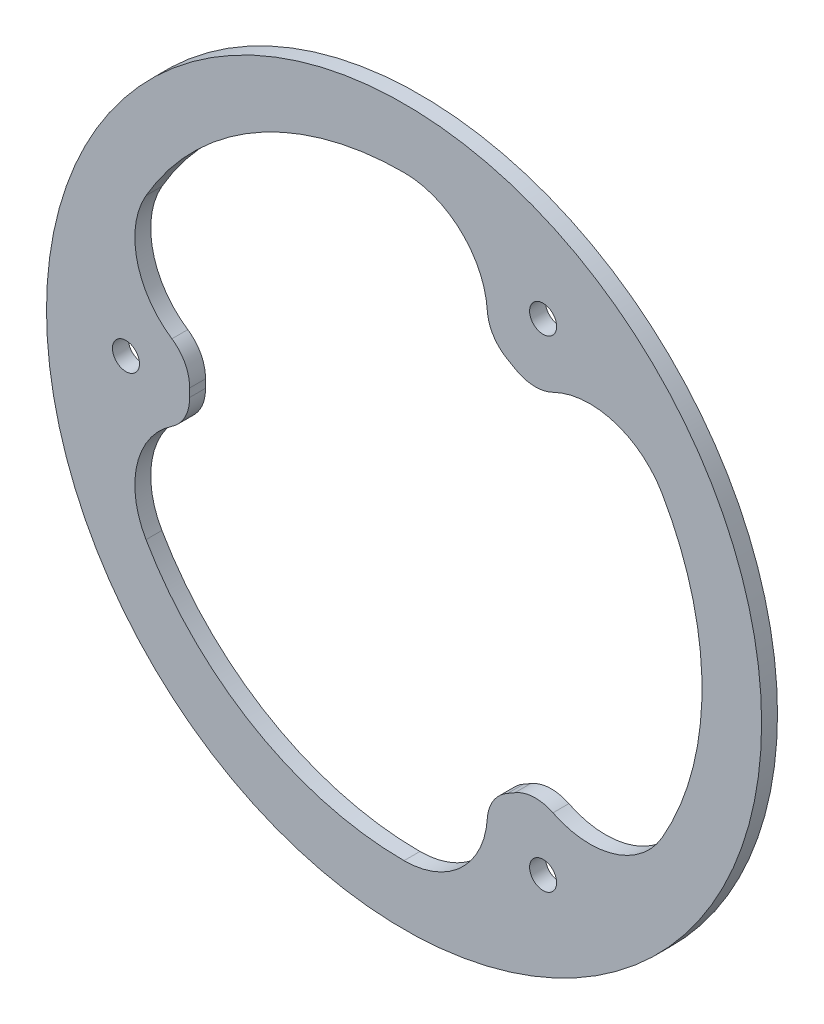
ISO-10303-21;
HEADER;
FILE_DESCRIPTION(('STEP AP214'),'2;1');
FILE_NAME('part.step','',(''),(''),'','','');
FILE_SCHEMA(('AUTOMOTIVE_DESIGN { 1 0 10303 214 1 1 1 1 }'));
ENDSEC;
DATA;
#1=APPLICATION_CONTEXT('core data for automotive mechanical design processes');
#2=APPLICATION_PROTOCOL_DEFINITION('international standard','automotive_design',2000,#1);
#3=PRODUCT_CONTEXT('',#1,'mechanical');
#4=PRODUCT('Part','Part','',(#3));
#5=PRODUCT_RELATED_PRODUCT_CATEGORY('part','',(#4));
#6=PRODUCT_DEFINITION_FORMATION('','',#4);
#7=PRODUCT_DEFINITION_CONTEXT('part definition',#1,'design');
#8=PRODUCT_DEFINITION('design','',#6,#7);
#9=PRODUCT_DEFINITION_SHAPE('','',#8);
#10=(LENGTH_UNIT() NAMED_UNIT(*) SI_UNIT(.MILLI.,.METRE.));
#11=(NAMED_UNIT(*) PLANE_ANGLE_UNIT() SI_UNIT($,.RADIAN.));
#12=(NAMED_UNIT(*) SI_UNIT($,.STERADIAN.) SOLID_ANGLE_UNIT());
#13=UNCERTAINTY_MEASURE_WITH_UNIT(LENGTH_MEASURE(1.E-05),#10,'distance_accuracy_value','');
#14=(GEOMETRIC_REPRESENTATION_CONTEXT(3) GLOBAL_UNCERTAINTY_ASSIGNED_CONTEXT((#13)) GLOBAL_UNIT_ASSIGNED_CONTEXT((#10,
#11,#12)) REPRESENTATION_CONTEXT('',''));
#15=CARTESIAN_POINT('',(0.,0.,0.));
#16=DIRECTION('',(0.,0.,1.));
#17=DIRECTION('',(1.,0.,0.));
#18=AXIS2_PLACEMENT_3D('',#15,#16,#17);
#19=CARTESIAN_POINT('',(0.,0.,14.));
#20=DIRECTION('',(0.,0.,1.));
#21=DIRECTION('',(1.,0.,0.));
#22=AXIS2_PLACEMENT_3D('',#19,#20,#21);
#23=PLANE('',#22);
#24=CARTESIAN_POINT('',(0.,0.,14.));
#25=DIRECTION('',(0.,0.,-1.));
#26=DIRECTION('',(-1.,0.,0.));
#27=AXIS2_PLACEMENT_3D('',#24,#25,#26);
#28=CIRCLE('',#27,27.);
#29=CARTESIAN_POINT('',(-26.9950568827488,-0.516627425867208,14.));
#30=VERTEX_POINT('',#29);
#31=CARTESIAN_POINT('',(-26.9950568827488,0.516627425867155,14.));
#32=VERTEX_POINT('',#31);
#33=EDGE_CURVE('E289',#30,#32,#28,.T.);
#34=ORIENTED_EDGE('',*,*,#33,.T.);
#35=CARTESIAN_POINT('',(-31.9941414906652,0.612299171398109,14.));
#36=DIRECTION('',(0.,0.,1.));
#37=DIRECTION('',(1.,0.,0.));
#38=AXIS2_PLACEMENT_3D('',#35,#36,#37);
#39=CIRCLE('',#38,5.);
#40=CARTESIAN_POINT('',(-29.2162525911538,4.76962201933419,14.));
#41=VERTEX_POINT('',#40);
#42=EDGE_CURVE('E263',#32,#41,#39,.T.);
#43=ORIENTED_EDGE('',*,*,#42,.T.);
#44=CARTESIAN_POINT('',(-23.3826859021799,13.4999999999999,14.));
#45=DIRECTION('',(0.,0.,-1.));
#46=DIRECTION('',(-1.,0.,0.));
#47=AXIS2_PLACEMENT_3D('',#44,#45,#46);
#48=CIRCLE('',#47,10.5);
#49=CARTESIAN_POINT('',(-32.4759526419165,18.7499999999999,14.));
#50=VERTEX_POINT('',#49);
#51=EDGE_CURVE('E210',#41,#50,#48,.T.);
#52=ORIENTED_EDGE('',*,*,#51,.T.);
#53=CARTESIAN_POINT('',(0.,0.,14.));
#54=DIRECTION('',(0.,0.,-1.));
#55=DIRECTION('',(-1.,0.,0.));
#56=AXIS2_PLACEMENT_3D('',#53,#54,#55);
#57=CIRCLE('',#56,37.5);
#58=CARTESIAN_POINT('',(0.,37.5,14.));
#59=VERTEX_POINT('',#58);
#60=EDGE_CURVE('E214',#50,#59,#57,.T.);
#61=ORIENTED_EDGE('',*,*,#60,.T.);
#62=CARTESIAN_POINT('',(0.,27.,14.));
#63=DIRECTION('',(0.,0.,-1.));
#64=DIRECTION('',(-1.,0.,0.));
#65=AXIS2_PLACEMENT_3D('',#62,#63,#64);
#66=CIRCLE('',#65,10.5);
#67=CARTESIAN_POINT('',(10.4775124603838,27.6868279569892,14.));
#68=VERTEX_POINT('',#67);
#69=EDGE_CURVE('E217',#59,#68,#66,.T.);
#70=ORIENTED_EDGE('',*,*,#69,.T.);
#71=CARTESIAN_POINT('',(15.4668041081856,28.0138888888889,14.));
#72=DIRECTION('',(0.,0.,1.));
#73=DIRECTION('',(1.,0.,0.));
#74=AXIS2_PLACEMENT_3D('',#71,#72,#73);
#75=CIRCLE('',#74,5.);
#76=CARTESIAN_POINT('',(13.0501159662816,23.63671875,14.));
#77=VERTEX_POINT('',#76);
#78=EDGE_CURVE('E52',#68,#77,#75,.T.);
#79=ORIENTED_EDGE('',*,*,#78,.T.);
#80=CARTESIAN_POINT('',(13.9449409164671,23.1200913241328,14.));
#81=VERTEX_POINT('',#80);
#82=EDGE_CURVE('E237',#77,#81,#28,.T.);
#83=ORIENTED_EDGE('',*,*,#82,.T.);
#84=CARTESIAN_POINT('',(16.5273373824795,27.4015897174907,14.));
#85=DIRECTION('',(0.,0.,1.));
#86=DIRECTION('',(1.,0.,0.));
#87=AXIS2_PLACEMENT_3D('',#84,#85,#86);
#88=CIRCLE('',#87,5.);
#89=CARTESIAN_POINT('',(18.7387401307699,22.917205937655,14.));
#90=VERTEX_POINT('',#89);
#91=EDGE_CURVE('E255',#81,#90,#88,.T.);
#92=ORIENTED_EDGE('',*,*,#91,.T.);
#93=CARTESIAN_POINT('',(23.3826859021798,13.5,14.));
#94=DIRECTION('',(0.,0.,-1.));
#95=DIRECTION('',(-1.,0.,0.));
#96=AXIS2_PLACEMENT_3D('',#93,#94,#95);
#97=CIRCLE('',#96,10.5);
#98=CARTESIAN_POINT('',(32.4759526419164,18.7500000000001,14.));
#99=VERTEX_POINT('',#98);
#100=EDGE_CURVE('E328',#90,#99,#97,.T.);
#101=ORIENTED_EDGE('',*,*,#100,.T.);
#102=CARTESIAN_POINT('',(0.,0.,14.));
#103=DIRECTION('',(0.,0.,-1.));
#104=DIRECTION('',(-1.,0.,0.));
#105=AXIS2_PLACEMENT_3D('',#102,#103,#104);
#106=CIRCLE('',#105,37.5);
#107=CARTESIAN_POINT('',(32.4759526419165,-18.75,14.));
#108=VERTEX_POINT('',#107);
#109=EDGE_CURVE('E329',#99,#108,#106,.T.);
#110=ORIENTED_EDGE('',*,*,#109,.T.);
#111=CARTESIAN_POINT('',(23.3826859021798,-13.5,14.));
#112=DIRECTION('',(0.,0.,-1.));
#113=DIRECTION('',(-1.,0.,0.));
#114=AXIS2_PLACEMENT_3D('',#111,#112,#113);
#115=CIRCLE('',#114,10.5);
#116=CARTESIAN_POINT('',(18.73874013077,-22.917205937655,14.));
#117=VERTEX_POINT('',#116);
#118=EDGE_CURVE('E191',#108,#117,#115,.T.);
#119=ORIENTED_EDGE('',*,*,#118,.T.);
#120=CARTESIAN_POINT('',(16.5273373824796,-27.4015897174907,14.));
#121=DIRECTION('',(0.,0.,1.));
#122=DIRECTION('',(1.,0.,0.));
#123=AXIS2_PLACEMENT_3D('',#120,#121,#122);
#124=CIRCLE('',#123,5.);
#125=CARTESIAN_POINT('',(13.9449409164672,-23.1200913241328,14.));
#126=VERTEX_POINT('',#125);
#127=EDGE_CURVE('E260',#117,#126,#124,.T.);
#128=ORIENTED_EDGE('',*,*,#127,.T.);
#129=CARTESIAN_POINT('',(13.0501159662817,-23.63671875,14.));
#130=VERTEX_POINT('',#129);
#131=EDGE_CURVE('E332',#126,#130,#28,.T.);
#132=ORIENTED_EDGE('',*,*,#131,.T.);
#133=CARTESIAN_POINT('',(15.4668041081857,-28.0138888888889,14.));
#134=DIRECTION('',(0.,0.,1.));
#135=DIRECTION('',(1.,0.,0.));
#136=AXIS2_PLACEMENT_3D('',#133,#134,#135);
#137=CIRCLE('',#136,5.);
#138=CARTESIAN_POINT('',(10.4775124603839,-27.6868279569892,14.));
#139=VERTEX_POINT('',#138);
#140=EDGE_CURVE('E258',#130,#139,#137,.T.);
#141=ORIENTED_EDGE('',*,*,#140,.T.);
#142=CARTESIAN_POINT('',(0.,-27.,14.));
#143=DIRECTION('',(0.,0.,-1.));
#144=DIRECTION('',(-1.,0.,0.));
#145=AXIS2_PLACEMENT_3D('',#142,#143,#144);
#146=CIRCLE('',#145,10.5);
#147=CARTESIAN_POINT('',(0.,-37.5,14.));
#148=VERTEX_POINT('',#147);
#149=EDGE_CURVE('E193',#139,#148,#146,.T.);
#150=ORIENTED_EDGE('',*,*,#149,.T.);
#151=CARTESIAN_POINT('',(0.,0.,14.));
#152=DIRECTION('',(0.,0.,-1.));
#153=DIRECTION('',(-1.,0.,0.));
#154=AXIS2_PLACEMENT_3D('',#151,#152,#153);
#155=CIRCLE('',#154,37.5);
#156=CARTESIAN_POINT('',(-32.4759526419165,-18.75,14.));
#157=VERTEX_POINT('',#156);
#158=EDGE_CURVE('E195',#148,#157,#155,.T.);
#159=ORIENTED_EDGE('',*,*,#158,.T.);
#160=CARTESIAN_POINT('',(-23.3826859021798,-13.5,14.));
#161=DIRECTION('',(0.,0.,-1.));
#162=DIRECTION('',(-1.,0.,0.));
#163=AXIS2_PLACEMENT_3D('',#160,#161,#162);
#164=CIRCLE('',#163,10.5);
#165=CARTESIAN_POINT('',(-29.2162525911538,-4.76962201933425,14.));
#166=VERTEX_POINT('',#165);
#167=EDGE_CURVE('E203',#157,#166,#164,.T.);
#168=ORIENTED_EDGE('',*,*,#167,.T.);
#169=CARTESIAN_POINT('',(-31.9941414906652,-0.612299171398172,14.));
#170=DIRECTION('',(0.,0.,1.));
#171=DIRECTION('',(1.,0.,0.));
#172=AXIS2_PLACEMENT_3D('',#169,#170,#171);
#173=CIRCLE('',#172,5.);
#174=EDGE_CURVE('E60',#166,#30,#173,.T.);
#175=ORIENTED_EDGE('',*,*,#174,.T.);
#176=EDGE_LOOP('',(#34,#43,#52,#61,#70,#79,#83,#92,#101,#110,#119,#128,#132,#141,#150,#159,#168,#175));
#177=FACE_BOUND('',#176,.T.);
#178=CARTESIAN_POINT('',(17.4999999999999,30.3108891324554,14.));
#179=DIRECTION('',(0.,0.,-1.));
#180=DIRECTION('',(-1.,0.,0.));
#181=AXIS2_PLACEMENT_3D('',#178,#179,#180);
#182=CIRCLE('',#181,1.7);
#183=CARTESIAN_POINT('',(15.7999999999999,30.3108891324554,14.));
#184=VERTEX_POINT('',#183);
#185=EDGE_CURVE('E316',#184,#184,#182,.T.);
#186=ORIENTED_EDGE('',*,*,#185,.T.);
#187=EDGE_LOOP('',(#186));
#188=FACE_BOUND('',#187,.T.);
#189=CARTESIAN_POINT('',(-35.,0.,14.));
#190=DIRECTION('',(0.,0.,-1.));
#191=DIRECTION('',(-1.,0.,0.));
#192=AXIS2_PLACEMENT_3D('',#189,#190,#191);
#193=CIRCLE('',#192,1.7);
#194=CARTESIAN_POINT('',(-36.7,0.,14.));
#195=VERTEX_POINT('',#194);
#196=EDGE_CURVE('E322',#195,#195,#193,.T.);
#197=ORIENTED_EDGE('',*,*,#196,.T.);
#198=EDGE_LOOP('',(#197));
#199=FACE_BOUND('',#198,.T.);
#200=CARTESIAN_POINT('',(17.4999999999998,-30.3108891324555,14.));
#201=DIRECTION('',(0.,0.,-1.));
#202=DIRECTION('',(-1.,0.,0.));
#203=AXIS2_PLACEMENT_3D('',#200,#201,#202);
#204=CIRCLE('',#203,1.7);
#205=CARTESIAN_POINT('',(15.7999999999998,-30.3108891324555,14.));
#206=VERTEX_POINT('',#205);
#207=EDGE_CURVE('E325',#206,#206,#204,.T.);
#208=ORIENTED_EDGE('',*,*,#207,.T.);
#209=EDGE_LOOP('',(#208));
#210=FACE_BOUND('',#209,.T.);
#211=CARTESIAN_POINT('',(0.,0.,14.));
#212=DIRECTION('',(0.,0.,1.));
#213=DIRECTION('',(1.,0.,0.));
#214=AXIS2_PLACEMENT_3D('',#211,#212,#213);
#215=CIRCLE('',#214,45.);
#216=CARTESIAN_POINT('',(45.,0.,14.));
#217=VERTEX_POINT('',#216);
#218=EDGE_CURVE('E227',#217,#217,#215,.T.);
#219=ORIENTED_EDGE('',*,*,#218,.T.);
#220=EDGE_LOOP('',(#219));
#221=FACE_BOUND('',#220,.T.);
#222=ADVANCED_FACE('F37',(#177,#188,#199,#210,#221),#23,.T.);
#223=CARTESIAN_POINT('',(0.,0.,12.));
#224=DIRECTION('',(0.,0.,1.));
#225=DIRECTION('',(1.,0.,0.));
#226=AXIS2_PLACEMENT_3D('',#223,#224,#225);
#227=PLANE('',#226);
#228=CARTESIAN_POINT('',(0.,0.,12.));
#229=DIRECTION('',(0.,0.,1.));
#230=DIRECTION('',(1.,0.,0.));
#231=AXIS2_PLACEMENT_3D('',#228,#229,#230);
#232=CIRCLE('',#231,45.);
#233=CARTESIAN_POINT('',(45.,0.,12.));
#234=VERTEX_POINT('',#233);
#235=EDGE_CURVE('E224',#234,#234,#232,.T.);
#236=ORIENTED_EDGE('',*,*,#235,.F.);
#237=EDGE_LOOP('',(#236));
#238=FACE_BOUND('',#237,.T.);
#239=CARTESIAN_POINT('',(17.4999999999998,-30.3108891324555,12.));
#240=DIRECTION('',(0.,0.,1.));
#241=DIRECTION('',(1.,0.,0.));
#242=AXIS2_PLACEMENT_3D('',#239,#240,#241);
#243=CIRCLE('',#242,1.69999999999999);
#244=CARTESIAN_POINT('',(19.1999999999998,-30.3108891324555,12.));
#245=VERTEX_POINT('',#244);
#246=EDGE_CURVE('E385',#245,#245,#243,.F.);
#247=ORIENTED_EDGE('',*,*,#246,.F.);
#248=EDGE_LOOP('',(#247));
#249=FACE_BOUND('',#248,.T.);
#250=CARTESIAN_POINT('',(17.4999999999999,30.3108891324554,12.));
#251=DIRECTION('',(0.,0.,1.));
#252=DIRECTION('',(1.,0.,0.));
#253=AXIS2_PLACEMENT_3D('',#250,#251,#252);
#254=CIRCLE('',#253,1.69999999999999);
#255=CARTESIAN_POINT('',(19.1999999999999,30.3108891324554,12.));
#256=VERTEX_POINT('',#255);
#257=EDGE_CURVE('E233',#256,#256,#254,.F.);
#258=ORIENTED_EDGE('',*,*,#257,.F.);
#259=EDGE_LOOP('',(#258));
#260=FACE_BOUND('',#259,.T.);
#261=CARTESIAN_POINT('',(-35.,0.,12.));
#262=DIRECTION('',(0.,0.,1.));
#263=DIRECTION('',(1.,0.,0.));
#264=AXIS2_PLACEMENT_3D('',#261,#262,#263);
#265=CIRCLE('',#264,1.69999999999999);
#266=CARTESIAN_POINT('',(-33.3,0.,12.));
#267=VERTEX_POINT('',#266);
#268=EDGE_CURVE('E236',#267,#267,#265,.F.);
#269=ORIENTED_EDGE('',*,*,#268,.F.);
#270=EDGE_LOOP('',(#269));
#271=FACE_BOUND('',#270,.T.);
#272=CARTESIAN_POINT('',(-23.3826859021799,13.4999999999999,12.));
#273=DIRECTION('',(0.,0.,1.));
#274=DIRECTION('',(1.,0.,0.));
#275=AXIS2_PLACEMENT_3D('',#272,#273,#274);
#276=CIRCLE('',#275,10.5);
#277=CARTESIAN_POINT('',(-29.2162525911538,4.76962201933419,12.));
#278=VERTEX_POINT('',#277);
#279=CARTESIAN_POINT('',(-32.4759526419165,18.7499999999999,12.));
#280=VERTEX_POINT('',#279);
#281=EDGE_CURVE('E310',#278,#280,#276,.F.);
#282=ORIENTED_EDGE('',*,*,#281,.F.);
#283=CARTESIAN_POINT('',(-31.9941414906652,0.612299171398109,12.));
#284=DIRECTION('',(0.,0.,1.));
#285=DIRECTION('',(1.,0.,0.));
#286=AXIS2_PLACEMENT_3D('',#283,#284,#285);
#287=CIRCLE('',#286,5.);
#288=CARTESIAN_POINT('',(-26.9950568827488,0.516627425867155,12.));
#289=VERTEX_POINT('',#288);
#290=EDGE_CURVE('E249',#278,#289,#287,.F.);
#291=ORIENTED_EDGE('',*,*,#290,.T.);
#292=CARTESIAN_POINT('',(0.,0.,12.));
#293=DIRECTION('',(0.,0.,-1.));
#294=DIRECTION('',(-1.,0.,0.));
#295=AXIS2_PLACEMENT_3D('',#292,#293,#294);
#296=CIRCLE('',#295,27.);
#297=CARTESIAN_POINT('',(-26.9950568827488,-0.516627425867208,12.));
#298=VERTEX_POINT('',#297);
#299=EDGE_CURVE('E292',#298,#289,#296,.T.);
#300=ORIENTED_EDGE('',*,*,#299,.F.);
#301=CARTESIAN_POINT('',(-31.9941414906652,-0.612299171398172,12.));
#302=DIRECTION('',(0.,0.,1.));
#303=DIRECTION('',(1.,0.,0.));
#304=AXIS2_PLACEMENT_3D('',#301,#302,#303);
#305=CIRCLE('',#304,5.);
#306=CARTESIAN_POINT('',(-29.2162525911538,-4.76962201933425,12.));
#307=VERTEX_POINT('',#306);
#308=EDGE_CURVE('E247',#298,#307,#305,.F.);
#309=ORIENTED_EDGE('',*,*,#308,.T.);
#310=CARTESIAN_POINT('',(-23.3826859021798,-13.5,12.));
#311=DIRECTION('',(0.,0.,1.));
#312=DIRECTION('',(1.,0.,0.));
#313=AXIS2_PLACEMENT_3D('',#310,#311,#312);
#314=CIRCLE('',#313,10.5);
#315=CARTESIAN_POINT('',(-32.4759526419165,-18.75,12.));
#316=VERTEX_POINT('',#315);
#317=EDGE_CURVE('E313',#316,#307,#314,.F.);
#318=ORIENTED_EDGE('',*,*,#317,.F.);
#319=CARTESIAN_POINT('',(0.,0.,12.));
#320=DIRECTION('',(0.,0.,1.));
#321=DIRECTION('',(1.,0.,0.));
#322=AXIS2_PLACEMENT_3D('',#319,#320,#321);
#323=CIRCLE('',#322,37.5);
#324=CARTESIAN_POINT('',(0.,-37.5,12.));
#325=VERTEX_POINT('',#324);
#326=EDGE_CURVE('E392',#325,#316,#323,.F.);
#327=ORIENTED_EDGE('',*,*,#326,.F.);
#328=CARTESIAN_POINT('',(0.,-27.,12.));
#329=DIRECTION('',(0.,0.,1.));
#330=DIRECTION('',(1.,0.,0.));
#331=AXIS2_PLACEMENT_3D('',#328,#329,#330);
#332=CIRCLE('',#331,10.5);
#333=CARTESIAN_POINT('',(10.4775124603839,-27.6868279569892,12.));
#334=VERTEX_POINT('',#333);
#335=EDGE_CURVE('E178',#334,#325,#332,.F.);
#336=ORIENTED_EDGE('',*,*,#335,.F.);
#337=CARTESIAN_POINT('',(15.4668041081857,-28.0138888888889,12.));
#338=DIRECTION('',(0.,0.,1.));
#339=DIRECTION('',(1.,0.,0.));
#340=AXIS2_PLACEMENT_3D('',#337,#338,#339);
#341=CIRCLE('',#340,5.);
#342=CARTESIAN_POINT('',(13.0501159662817,-23.63671875,12.));
#343=VERTEX_POINT('',#342);
#344=EDGE_CURVE('E244',#334,#343,#341,.F.);
#345=ORIENTED_EDGE('',*,*,#344,.T.);
#346=CARTESIAN_POINT('',(13.9449409164672,-23.1200913241328,12.));
#347=VERTEX_POINT('',#346);
#348=EDGE_CURVE('E290',#347,#343,#296,.T.);
#349=ORIENTED_EDGE('',*,*,#348,.F.);
#350=CARTESIAN_POINT('',(16.5273373824796,-27.4015897174907,12.));
#351=DIRECTION('',(0.,0.,1.));
#352=DIRECTION('',(1.,0.,0.));
#353=AXIS2_PLACEMENT_3D('',#350,#351,#352);
#354=CIRCLE('',#353,5.);
#355=CARTESIAN_POINT('',(18.73874013077,-22.917205937655,12.));
#356=VERTEX_POINT('',#355);
#357=EDGE_CURVE('E173',#347,#356,#354,.F.);
#358=ORIENTED_EDGE('',*,*,#357,.T.);
#359=CARTESIAN_POINT('',(23.3826859021798,-13.5,12.));
#360=DIRECTION('',(0.,0.,1.));
#361=DIRECTION('',(1.,0.,0.));
#362=AXIS2_PLACEMENT_3D('',#359,#360,#361);
#363=CIRCLE('',#362,10.5);
#364=CARTESIAN_POINT('',(32.4759526419164,-18.75,12.));
#365=VERTEX_POINT('',#364);
#366=EDGE_CURVE('E164',#365,#356,#363,.F.);
#367=ORIENTED_EDGE('',*,*,#366,.F.);
#368=CARTESIAN_POINT('',(0.,0.,12.));
#369=DIRECTION('',(0.,0.,1.));
#370=DIRECTION('',(1.,0.,0.));
#371=AXIS2_PLACEMENT_3D('',#368,#369,#370);
#372=CIRCLE('',#371,37.5);
#373=CARTESIAN_POINT('',(32.4759526419164,18.7500000000001,12.));
#374=VERTEX_POINT('',#373);
#375=EDGE_CURVE('E169',#374,#365,#372,.F.);
#376=ORIENTED_EDGE('',*,*,#375,.F.);
#377=CARTESIAN_POINT('',(23.3826859021798,13.5,12.));
#378=DIRECTION('',(0.,0.,1.));
#379=DIRECTION('',(1.,0.,0.));
#380=AXIS2_PLACEMENT_3D('',#377,#378,#379);
#381=CIRCLE('',#380,10.5);
#382=CARTESIAN_POINT('',(18.7387401307699,22.917205937655,12.));
#383=VERTEX_POINT('',#382);
#384=EDGE_CURVE('E187',#383,#374,#381,.F.);
#385=ORIENTED_EDGE('',*,*,#384,.F.);
#386=CARTESIAN_POINT('',(16.5273373824795,27.4015897174907,12.));
#387=DIRECTION('',(0.,0.,1.));
#388=DIRECTION('',(1.,0.,0.));
#389=AXIS2_PLACEMENT_3D('',#386,#387,#388);
#390=CIRCLE('',#389,5.);
#391=CARTESIAN_POINT('',(13.9449409164671,23.1200913241328,12.));
#392=VERTEX_POINT('',#391);
#393=EDGE_CURVE('E240',#383,#392,#390,.F.);
#394=ORIENTED_EDGE('',*,*,#393,.T.);
#395=CARTESIAN_POINT('',(13.0501159662816,23.63671875,12.));
#396=VERTEX_POINT('',#395);
#397=EDGE_CURVE('E284',#396,#392,#296,.T.);
#398=ORIENTED_EDGE('',*,*,#397,.F.);
#399=CARTESIAN_POINT('',(15.4668041081856,28.0138888888889,12.));
#400=DIRECTION('',(0.,0.,1.));
#401=DIRECTION('',(1.,0.,0.));
#402=AXIS2_PLACEMENT_3D('',#399,#400,#401);
#403=CIRCLE('',#402,5.);
#404=CARTESIAN_POINT('',(10.4775124603838,27.6868279569892,12.));
#405=VERTEX_POINT('',#404);
#406=EDGE_CURVE('E242',#396,#405,#403,.F.);
#407=ORIENTED_EDGE('',*,*,#406,.T.);
#408=CARTESIAN_POINT('',(0.,27.,12.));
#409=DIRECTION('',(0.,0.,1.));
#410=DIRECTION('',(1.,0.,0.));
#411=AXIS2_PLACEMENT_3D('',#408,#409,#410);
#412=CIRCLE('',#411,10.5);
#413=CARTESIAN_POINT('',(0.,37.5,12.));
#414=VERTEX_POINT('',#413);
#415=EDGE_CURVE('E297',#414,#405,#412,.F.);
#416=ORIENTED_EDGE('',*,*,#415,.F.);
#417=CARTESIAN_POINT('',(0.,0.,12.));
#418=DIRECTION('',(0.,0.,1.));
#419=DIRECTION('',(1.,0.,0.));
#420=AXIS2_PLACEMENT_3D('',#417,#418,#419);
#421=CIRCLE('',#420,37.5);
#422=EDGE_CURVE('E312',#280,#414,#421,.F.);
#423=ORIENTED_EDGE('',*,*,#422,.F.);
#424=EDGE_LOOP('',(#282,#291,#300,#309,#318,#327,#336,#345,#349,#358,#367,#376,#385,#394,#398,
#407,#416,#423));
#425=FACE_BOUND('',#424,.T.);
#426=ADVANCED_FACE('F167',(#238,#249,#260,#271,#425),#227,.F.);
#427=CARTESIAN_POINT('',(0.,0.,14.));
#428=DIRECTION('',(0.,0.,-1.));
#429=DIRECTION('',(-1.,0.,0.));
#430=AXIS2_PLACEMENT_3D('',#427,#428,#429);
#431=CYLINDRICAL_SURFACE('',#430,45.);
#432=ORIENTED_EDGE('',*,*,#218,.F.);
#433=EDGE_LOOP('',(#432));
#434=FACE_BOUND('',#433,.T.);
#435=ORIENTED_EDGE('',*,*,#235,.T.);
#436=EDGE_LOOP('',(#435));
#437=FACE_BOUND('',#436,.T.);
#438=ADVANCED_FACE('F359',(#434,#437),#431,.T.);
#439=CARTESIAN_POINT('',(0.,27.,14.));
#440=DIRECTION('',(0.,0.,-1.));
#441=DIRECTION('',(-1.,0.,0.));
#442=AXIS2_PLACEMENT_3D('',#439,#440,#441);
#443=CYLINDRICAL_SURFACE('',#442,10.5);
#444=ORIENTED_EDGE('',*,*,#415,.T.);
#445=DIRECTION('',(0.,0.,-1.));
#446=VECTOR('',#445,1.);
#447=CARTESIAN_POINT('',(10.4775124603838,27.6868279569892,14.));
#448=LINE('',#447,#446);
#449=EDGE_CURVE('E276',#405,#68,#448,.F.);
#450=ORIENTED_EDGE('',*,*,#449,.T.);
#451=ORIENTED_EDGE('',*,*,#69,.F.);
#452=DIRECTION('',(0.,0.,-1.));
#453=VECTOR('',#452,1.);
#454=CARTESIAN_POINT('',(0.,37.5,14.));
#455=LINE('',#454,#453);
#456=EDGE_CURVE('E221',#59,#414,#455,.T.);
#457=ORIENTED_EDGE('',*,*,#456,.T.);
#458=EDGE_LOOP('',(#444,#450,#451,#457));
#459=FACE_BOUND('',#458,.T.);
#460=ADVANCED_FACE('F296',(#459),#443,.F.);
#461=CARTESIAN_POINT('',(0.,0.,14.));
#462=DIRECTION('',(0.,0.,-1.));
#463=DIRECTION('',(-1.,0.,0.));
#464=AXIS2_PLACEMENT_3D('',#461,#462,#463);
#465=CYLINDRICAL_SURFACE('',#464,37.5);
#466=DIRECTION('',(0.,0.,-1.));
#467=VECTOR('',#466,1.);
#468=CARTESIAN_POINT('',(-32.4759526419165,18.7499999999999,14.));
#469=LINE('',#468,#467);
#470=EDGE_CURVE('E220',#50,#280,#469,.T.);
#471=ORIENTED_EDGE('',*,*,#470,.T.);
#472=ORIENTED_EDGE('',*,*,#422,.T.);
#473=ORIENTED_EDGE('',*,*,#456,.F.);
#474=ORIENTED_EDGE('',*,*,#60,.F.);
#475=EDGE_LOOP('',(#471,#472,#473,#474));
#476=FACE_BOUND('',#475,.T.);
#477=ADVANCED_FACE('F305',(#476),#465,.F.);
#478=CARTESIAN_POINT('',(-23.3826859021799,13.4999999999999,14.));
#479=DIRECTION('',(0.,0.,-1.));
#480=DIRECTION('',(-1.,0.,0.));
#481=AXIS2_PLACEMENT_3D('',#478,#479,#480);
#482=CYLINDRICAL_SURFACE('',#481,10.5);
#483=ORIENTED_EDGE('',*,*,#51,.F.);
#484=DIRECTION('',(0.,0.,-1.));
#485=VECTOR('',#484,1.);
#486=CARTESIAN_POINT('',(-29.2162525911538,4.76962201933419,14.));
#487=LINE('',#486,#485);
#488=EDGE_CURVE('E230',#41,#278,#487,.T.);
#489=ORIENTED_EDGE('',*,*,#488,.T.);
#490=ORIENTED_EDGE('',*,*,#281,.T.);
#491=ORIENTED_EDGE('',*,*,#470,.F.);
#492=EDGE_LOOP('',(#483,#489,#490,#491));
#493=FACE_BOUND('',#492,.T.);
#494=ADVANCED_FACE('F308',(#493),#482,.F.);
#495=CARTESIAN_POINT('',(-23.3826859021798,-13.5,14.));
#496=DIRECTION('',(0.,0.,-1.));
#497=DIRECTION('',(-1.,0.,0.));
#498=AXIS2_PLACEMENT_3D('',#495,#496,#497);
#499=CYLINDRICAL_SURFACE('',#498,10.5);
#500=ORIENTED_EDGE('',*,*,#317,.T.);
#501=DIRECTION('',(0.,0.,-1.));
#502=VECTOR('',#501,1.);
#503=CARTESIAN_POINT('',(-29.2162525911538,-4.76962201933424,14.));
#504=LINE('',#503,#502);
#505=EDGE_CURVE('E265',#307,#166,#504,.F.);
#506=ORIENTED_EDGE('',*,*,#505,.T.);
#507=ORIENTED_EDGE('',*,*,#167,.F.);
#508=DIRECTION('',(0.,0.,-1.));
#509=VECTOR('',#508,1.);
#510=CARTESIAN_POINT('',(-32.4759526419165,-18.75,14.));
#511=LINE('',#510,#509);
#512=EDGE_CURVE('E207',#157,#316,#511,.T.);
#513=ORIENTED_EDGE('',*,*,#512,.T.);
#514=EDGE_LOOP('',(#500,#506,#507,#513));
#515=FACE_BOUND('',#514,.T.);
#516=ADVANCED_FACE('F396',(#515),#499,.F.);
#517=CARTESIAN_POINT('',(0.,0.,14.));
#518=DIRECTION('',(0.,0.,-1.));
#519=DIRECTION('',(-1.,0.,0.));
#520=AXIS2_PLACEMENT_3D('',#517,#518,#519);
#521=CYLINDRICAL_SURFACE('',#520,37.5);
#522=DIRECTION('',(0.,0.,-1.));
#523=VECTOR('',#522,1.);
#524=CARTESIAN_POINT('',(0.,-37.5,14.));
#525=LINE('',#524,#523);
#526=EDGE_CURVE('E206',#148,#325,#525,.T.);
#527=ORIENTED_EDGE('',*,*,#526,.T.);
#528=ORIENTED_EDGE('',*,*,#326,.T.);
#529=ORIENTED_EDGE('',*,*,#512,.F.);
#530=ORIENTED_EDGE('',*,*,#158,.F.);
#531=EDGE_LOOP('',(#527,#528,#529,#530));
#532=FACE_BOUND('',#531,.T.);
#533=ADVANCED_FACE('F445',(#532),#521,.F.);
#534=CARTESIAN_POINT('',(0.,-27.,14.));
#535=DIRECTION('',(0.,0.,-1.));
#536=DIRECTION('',(-1.,0.,0.));
#537=AXIS2_PLACEMENT_3D('',#534,#535,#536);
#538=CYLINDRICAL_SURFACE('',#537,10.5);
#539=ORIENTED_EDGE('',*,*,#149,.F.);
#540=DIRECTION('',(0.,0.,-1.));
#541=VECTOR('',#540,1.);
#542=CARTESIAN_POINT('',(10.4775124603839,-27.6868279569892,14.));
#543=LINE('',#542,#541);
#544=EDGE_CURVE('E273',#139,#334,#543,.T.);
#545=ORIENTED_EDGE('',*,*,#544,.T.);
#546=ORIENTED_EDGE('',*,*,#335,.T.);
#547=ORIENTED_EDGE('',*,*,#526,.F.);
#548=EDGE_LOOP('',(#539,#545,#546,#547));
#549=FACE_BOUND('',#548,.T.);
#550=ADVANCED_FACE('F438',(#549),#538,.F.);
#551=CARTESIAN_POINT('',(23.3826859021798,-13.5,14.));
#552=DIRECTION('',(0.,0.,-1.));
#553=DIRECTION('',(-1.,0.,0.));
#554=AXIS2_PLACEMENT_3D('',#551,#552,#553);
#555=CYLINDRICAL_SURFACE('',#554,10.5);
#556=ORIENTED_EDGE('',*,*,#366,.T.);
#557=DIRECTION('',(0.,0.,-1.));
#558=VECTOR('',#557,1.);
#559=CARTESIAN_POINT('',(18.73874013077,-22.917205937655,14.));
#560=LINE('',#559,#558);
#561=EDGE_CURVE('E267',#356,#117,#560,.F.);
#562=ORIENTED_EDGE('',*,*,#561,.T.);
#563=ORIENTED_EDGE('',*,*,#118,.F.);
#564=DIRECTION('',(0.,0.,-1.));
#565=VECTOR('',#564,1.);
#566=CARTESIAN_POINT('',(32.4759526419165,-18.75,14.));
#567=LINE('',#566,#565);
#568=EDGE_CURVE('E183',#108,#365,#567,.T.);
#569=ORIENTED_EDGE('',*,*,#568,.T.);
#570=EDGE_LOOP('',(#556,#562,#563,#569));
#571=FACE_BOUND('',#570,.T.);
#572=ADVANCED_FACE('F189',(#571),#555,.F.);
#573=CARTESIAN_POINT('',(0.,0.,14.));
#574=DIRECTION('',(0.,0.,-1.));
#575=DIRECTION('',(-1.,0.,0.));
#576=AXIS2_PLACEMENT_3D('',#573,#574,#575);
#577=CYLINDRICAL_SURFACE('',#576,37.5);
#578=DIRECTION('',(0.,0.,-1.));
#579=VECTOR('',#578,1.);
#580=CARTESIAN_POINT('',(32.4759526419164,18.7500000000001,14.));
#581=LINE('',#580,#579);
#582=EDGE_CURVE('E186',#99,#374,#581,.T.);
#583=ORIENTED_EDGE('',*,*,#582,.T.);
#584=ORIENTED_EDGE('',*,*,#375,.T.);
#585=ORIENTED_EDGE('',*,*,#568,.F.);
#586=ORIENTED_EDGE('',*,*,#109,.F.);
#587=EDGE_LOOP('',(#583,#584,#585,#586));
#588=FACE_BOUND('',#587,.T.);
#589=ADVANCED_FACE('F181',(#588),#577,.F.);
#590=CARTESIAN_POINT('',(23.3826859021798,13.5,14.));
#591=DIRECTION('',(0.,0.,-1.));
#592=DIRECTION('',(-1.,0.,0.));
#593=AXIS2_PLACEMENT_3D('',#590,#591,#592);
#594=CYLINDRICAL_SURFACE('',#593,10.5);
#595=ORIENTED_EDGE('',*,*,#100,.F.);
#596=DIRECTION('',(0.,0.,-1.));
#597=VECTOR('',#596,1.);
#598=CARTESIAN_POINT('',(18.7387401307699,22.917205937655,14.));
#599=LINE('',#598,#597);
#600=EDGE_CURVE('E11',#90,#383,#599,.T.);
#601=ORIENTED_EDGE('',*,*,#600,.T.);
#602=ORIENTED_EDGE('',*,*,#384,.T.);
#603=ORIENTED_EDGE('',*,*,#582,.F.);
#604=EDGE_LOOP('',(#595,#601,#602,#603));
#605=FACE_BOUND('',#604,.T.);
#606=ADVANCED_FACE('F384',(#605),#594,.F.);
#607=CARTESIAN_POINT('',(17.4999999999998,-30.3108891324555,0.));
#608=DIRECTION('',(0.,0.,-1.));
#609=DIRECTION('',(-1.,0.,0.));
#610=AXIS2_PLACEMENT_3D('',#607,#608,#609);
#611=CYLINDRICAL_SURFACE('',#610,1.69999999999999);
#612=ORIENTED_EDGE('',*,*,#246,.T.);
#613=EDGE_LOOP('',(#612));
#614=FACE_BOUND('',#613,.T.);
#615=ORIENTED_EDGE('',*,*,#207,.F.);
#616=EDGE_LOOP('',(#615));
#617=FACE_BOUND('',#616,.T.);
#618=ADVANCED_FACE('F410',(#614,#617),#611,.F.);
#619=CARTESIAN_POINT('',(-35.,0.,0.));
#620=DIRECTION('',(0.,0.,-1.));
#621=DIRECTION('',(-1.,0.,0.));
#622=AXIS2_PLACEMENT_3D('',#619,#620,#621);
#623=CYLINDRICAL_SURFACE('',#622,1.69999999999999);
#624=ORIENTED_EDGE('',*,*,#268,.T.);
#625=EDGE_LOOP('',(#624));
#626=FACE_BOUND('',#625,.T.);
#627=ORIENTED_EDGE('',*,*,#196,.F.);
#628=EDGE_LOOP('',(#627));
#629=FACE_BOUND('',#628,.T.);
#630=ADVANCED_FACE('F405',(#626,#629),#623,.F.);
#631=CARTESIAN_POINT('',(17.4999999999999,30.3108891324554,0.));
#632=DIRECTION('',(0.,0.,-1.));
#633=DIRECTION('',(-1.,0.,0.));
#634=AXIS2_PLACEMENT_3D('',#631,#632,#633);
#635=CYLINDRICAL_SURFACE('',#634,1.69999999999999);
#636=ORIENTED_EDGE('',*,*,#257,.T.);
#637=EDGE_LOOP('',(#636));
#638=FACE_BOUND('',#637,.T.);
#639=ORIENTED_EDGE('',*,*,#185,.F.);
#640=EDGE_LOOP('',(#639));
#641=FACE_BOUND('',#640,.T.);
#642=ADVANCED_FACE('F409',(#638,#641),#635,.F.);
#643=CARTESIAN_POINT('',(0.,0.,14.));
#644=DIRECTION('',(0.,0.,-1.));
#645=DIRECTION('',(-1.,0.,0.));
#646=AXIS2_PLACEMENT_3D('',#643,#644,#645);
#647=CYLINDRICAL_SURFACE('',#646,27.);
#648=ORIENTED_EDGE('',*,*,#82,.F.);
#649=DIRECTION('',(0.,0.,-1.));
#650=VECTOR('',#649,1.);
#651=CARTESIAN_POINT('',(13.0501159662816,23.63671875,14.));
#652=LINE('',#651,#650);
#653=EDGE_CURVE('E45',#77,#396,#652,.T.);
#654=ORIENTED_EDGE('',*,*,#653,.T.);
#655=ORIENTED_EDGE('',*,*,#397,.T.);
#656=DIRECTION('',(0.,0.,-1.));
#657=VECTOR('',#656,1.);
#658=CARTESIAN_POINT('',(13.9449409164671,23.1200913241328,14.));
#659=LINE('',#658,#657);
#660=EDGE_CURVE('E278',#392,#81,#659,.F.);
#661=ORIENTED_EDGE('',*,*,#660,.T.);
#662=EDGE_LOOP('',(#648,#654,#655,#661));
#663=FACE_BOUND('',#662,.T.);
#664=ADVANCED_FACE('F283',(#663),#647,.F.);
#665=ORIENTED_EDGE('',*,*,#131,.F.);
#666=DIRECTION('',(0.,0.,-1.));
#667=VECTOR('',#666,1.);
#668=CARTESIAN_POINT('',(13.9449409164672,-23.1200913241328,14.));
#669=LINE('',#668,#667);
#670=EDGE_CURVE('E271',#126,#347,#669,.T.);
#671=ORIENTED_EDGE('',*,*,#670,.T.);
#672=ORIENTED_EDGE('',*,*,#348,.T.);
#673=DIRECTION('',(0.,0.,-1.));
#674=VECTOR('',#673,1.);
#675=CARTESIAN_POINT('',(13.0501159662817,-23.63671875,14.));
#676=LINE('',#675,#674);
#677=EDGE_CURVE('E269',#343,#130,#676,.F.);
#678=ORIENTED_EDGE('',*,*,#677,.T.);
#679=EDGE_LOOP('',(#665,#671,#672,#678));
#680=FACE_BOUND('',#679,.T.);
#681=ADVANCED_FACE('F337',(#680),#647,.F.);
#682=ORIENTED_EDGE('',*,*,#299,.T.);
#683=DIRECTION('',(0.,0.,-1.));
#684=VECTOR('',#683,1.);
#685=CARTESIAN_POINT('',(-26.9950568827488,0.516627425867155,14.));
#686=LINE('',#685,#684);
#687=EDGE_CURVE('E253',#289,#32,#686,.F.);
#688=ORIENTED_EDGE('',*,*,#687,.T.);
#689=ORIENTED_EDGE('',*,*,#33,.F.);
#690=DIRECTION('',(0.,0.,-1.));
#691=VECTOR('',#690,1.);
#692=CARTESIAN_POINT('',(-26.9950568827488,-0.516627425867208,14.));
#693=LINE('',#692,#691);
#694=EDGE_CURVE('E251',#30,#298,#693,.T.);
#695=ORIENTED_EDGE('',*,*,#694,.T.);
#696=EDGE_LOOP('',(#682,#688,#689,#695));
#697=FACE_BOUND('',#696,.T.);
#698=ADVANCED_FACE('F369',(#697),#647,.F.);
#699=CARTESIAN_POINT('',(-31.9941414906652,0.612299171398109,14.));
#700=DIRECTION('',(0.,0.,-1.));
#701=DIRECTION('',(-1.,0.,0.));
#702=AXIS2_PLACEMENT_3D('',#699,#700,#701);
#703=CYLINDRICAL_SURFACE('',#702,5.);
#704=ORIENTED_EDGE('',*,*,#42,.F.);
#705=ORIENTED_EDGE('',*,*,#687,.F.);
#706=ORIENTED_EDGE('',*,*,#290,.F.);
#707=ORIENTED_EDGE('',*,*,#488,.F.);
#708=EDGE_LOOP('',(#704,#705,#706,#707));
#709=FACE_BOUND('',#708,.T.);
#710=ADVANCED_FACE('F352',(#709),#703,.T.);
#711=CARTESIAN_POINT('',(-31.9941414906652,-0.612299171398172,14.));
#712=DIRECTION('',(0.,0.,1.));
#713=DIRECTION('',(1.,0.,0.));
#714=AXIS2_PLACEMENT_3D('',#711,#712,#713);
#715=CYLINDRICAL_SURFACE('',#714,5.);
#716=ORIENTED_EDGE('',*,*,#308,.F.);
#717=ORIENTED_EDGE('',*,*,#694,.F.);
#718=ORIENTED_EDGE('',*,*,#174,.F.);
#719=ORIENTED_EDGE('',*,*,#505,.F.);
#720=EDGE_LOOP('',(#716,#717,#718,#719));
#721=FACE_BOUND('',#720,.T.);
#722=ADVANCED_FACE('F344',(#721),#715,.T.);
#723=CARTESIAN_POINT('',(16.5273373824796,-27.4015897174907,14.));
#724=DIRECTION('',(0.,0.,1.));
#725=DIRECTION('',(1.,0.,0.));
#726=AXIS2_PLACEMENT_3D('',#723,#724,#725);
#727=CYLINDRICAL_SURFACE('',#726,5.);
#728=ORIENTED_EDGE('',*,*,#357,.F.);
#729=ORIENTED_EDGE('',*,*,#670,.F.);
#730=ORIENTED_EDGE('',*,*,#127,.F.);
#731=ORIENTED_EDGE('',*,*,#561,.F.);
#732=EDGE_LOOP('',(#728,#729,#730,#731));
#733=FACE_BOUND('',#732,.T.);
#734=ADVANCED_FACE('F341',(#733),#727,.T.);
#735=CARTESIAN_POINT('',(15.4668041081857,-28.0138888888889,14.));
#736=DIRECTION('',(0.,0.,-1.));
#737=DIRECTION('',(-1.,0.,0.));
#738=AXIS2_PLACEMENT_3D('',#735,#736,#737);
#739=CYLINDRICAL_SURFACE('',#738,5.);
#740=ORIENTED_EDGE('',*,*,#140,.F.);
#741=ORIENTED_EDGE('',*,*,#677,.F.);
#742=ORIENTED_EDGE('',*,*,#344,.F.);
#743=ORIENTED_EDGE('',*,*,#544,.F.);
#744=EDGE_LOOP('',(#740,#741,#742,#743));
#745=FACE_BOUND('',#744,.T.);
#746=ADVANCED_FACE('F343',(#745),#739,.T.);
#747=CARTESIAN_POINT('',(15.4668041081856,28.0138888888889,14.));
#748=DIRECTION('',(0.,0.,1.));
#749=DIRECTION('',(1.,0.,0.));
#750=AXIS2_PLACEMENT_3D('',#747,#748,#749);
#751=CYLINDRICAL_SURFACE('',#750,5.);
#752=ORIENTED_EDGE('',*,*,#406,.F.);
#753=ORIENTED_EDGE('',*,*,#653,.F.);
#754=ORIENTED_EDGE('',*,*,#78,.F.);
#755=ORIENTED_EDGE('',*,*,#449,.F.);
#756=EDGE_LOOP('',(#752,#753,#754,#755));
#757=FACE_BOUND('',#756,.T.);
#758=ADVANCED_FACE('F293',(#757),#751,.T.);
#759=CARTESIAN_POINT('',(16.5273373824795,27.4015897174907,14.));
#760=DIRECTION('',(0.,0.,-1.));
#761=DIRECTION('',(-1.,0.,0.));
#762=AXIS2_PLACEMENT_3D('',#759,#760,#761);
#763=CYLINDRICAL_SURFACE('',#762,5.);
#764=ORIENTED_EDGE('',*,*,#91,.F.);
#765=ORIENTED_EDGE('',*,*,#660,.F.);
#766=ORIENTED_EDGE('',*,*,#393,.F.);
#767=ORIENTED_EDGE('',*,*,#600,.F.);
#768=EDGE_LOOP('',(#764,#765,#766,#767));
#769=FACE_BOUND('',#768,.T.);
#770=ADVANCED_FACE('F39',(#769),#763,.T.);
#771=CLOSED_SHELL('',(#222,#426,#438,#460,#477,#494,#516,#533,#550,#572,#589,#606,#618,#630,
#642,#664,#681,#698,#710,#722,#734,#746,#758,#770));
#772=MANIFOLD_SOLID_BREP('B2',#771);
#773=ADVANCED_BREP_SHAPE_REPRESENTATION('',(#18,#772),#14);
#774=SHAPE_DEFINITION_REPRESENTATION(#9,#773);
ENDSEC;
END-ISO-10303-21;
